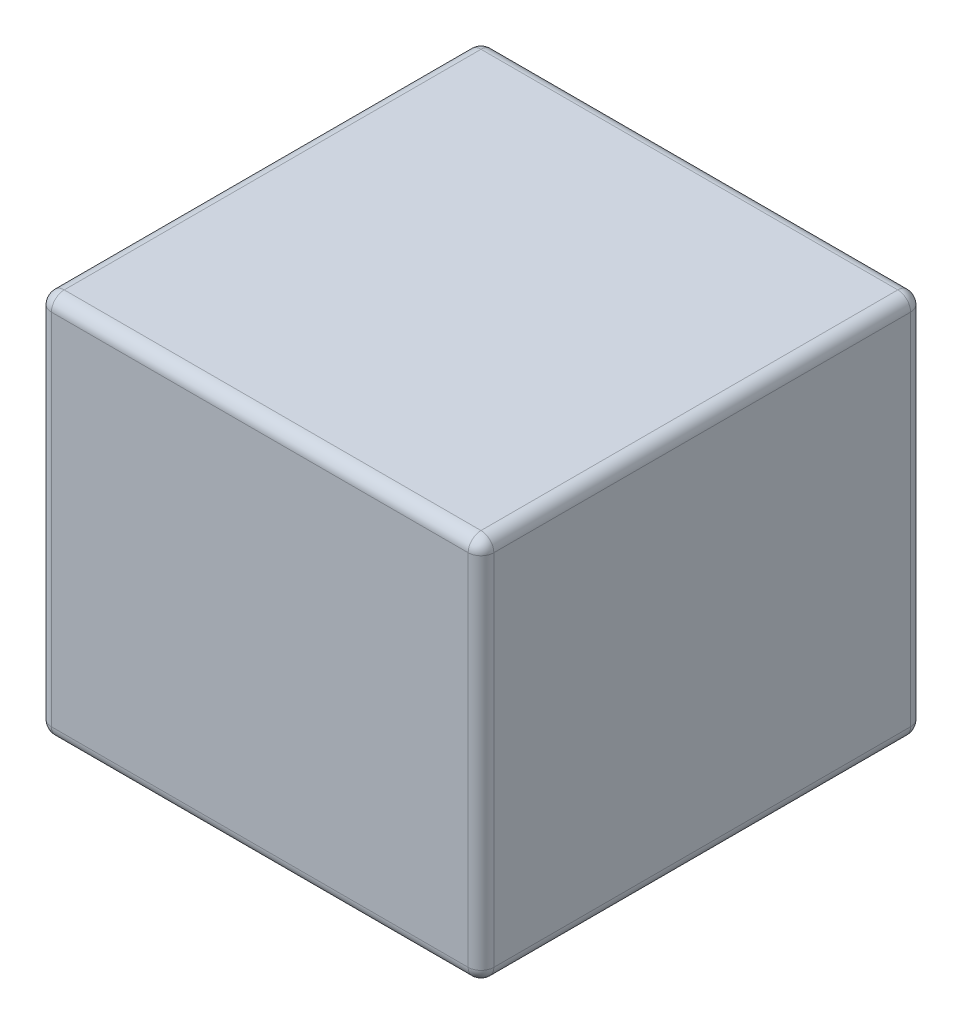
ISO-10303-21;
HEADER;
FILE_DESCRIPTION(('STEP AP214'),'2;1');
FILE_NAME('part.step','',(''),(''),'','','');
FILE_SCHEMA(('AUTOMOTIVE_DESIGN { 1 0 10303 214 1 1 1 1 }'));
ENDSEC;
DATA;
#1=APPLICATION_CONTEXT('core data for automotive mechanical design processes');
#2=APPLICATION_PROTOCOL_DEFINITION('international standard','automotive_design',2000,#1);
#3=PRODUCT_CONTEXT('',#1,'mechanical');
#4=PRODUCT('Part','Part','',(#3));
#5=PRODUCT_RELATED_PRODUCT_CATEGORY('part','',(#4));
#6=PRODUCT_DEFINITION_FORMATION('','',#4);
#7=PRODUCT_DEFINITION_CONTEXT('part definition',#1,'design');
#8=PRODUCT_DEFINITION('design','',#6,#7);
#9=PRODUCT_DEFINITION_SHAPE('','',#8);
#10=(LENGTH_UNIT() NAMED_UNIT(*) SI_UNIT(.MILLI.,.METRE.));
#11=(NAMED_UNIT(*) PLANE_ANGLE_UNIT() SI_UNIT($,.RADIAN.));
#12=(NAMED_UNIT(*) SI_UNIT($,.STERADIAN.) SOLID_ANGLE_UNIT());
#13=UNCERTAINTY_MEASURE_WITH_UNIT(LENGTH_MEASURE(1.E-05),#10,'distance_accuracy_value','');
#14=(GEOMETRIC_REPRESENTATION_CONTEXT(3) GLOBAL_UNCERTAINTY_ASSIGNED_CONTEXT((#13)) GLOBAL_UNIT_ASSIGNED_CONTEXT((#10,
#11,#12)) REPRESENTATION_CONTEXT('',''));
#15=CARTESIAN_POINT('',(0.,0.,0.));
#16=DIRECTION('',(0.,0.,1.));
#17=DIRECTION('',(1.,0.,0.));
#18=AXIS2_PLACEMENT_3D('',#15,#16,#17);
#19=CARTESIAN_POINT('',(21.9075,38.1,21.9075));
#20=DIRECTION('',(-1.,0.,0.));
#21=DIRECTION('',(0.,0.,1.));
#22=AXIS2_PLACEMENT_3D('',#19,#20,#21);
#23=PLANE('',#22);
#24=DIRECTION('',(0.,0.,-1.));
#25=VECTOR('',#24,1.);
#26=CARTESIAN_POINT('',(21.9075,36.83,21.9075));
#27=LINE('',#26,#25);
#28=CARTESIAN_POINT('',(21.9075,36.83,-20.6375));
#29=VERTEX_POINT('',#28);
#30=CARTESIAN_POINT('',(21.9075,36.83,20.6375));
#31=VERTEX_POINT('',#30);
#32=EDGE_CURVE('E41',#29,#31,#27,.F.);
#33=ORIENTED_EDGE('',*,*,#32,.T.);
#34=DIRECTION('',(0.,-1.,0.));
#35=VECTOR('',#34,1.);
#36=CARTESIAN_POINT('',(21.9075,38.1,20.6375));
#37=LINE('',#36,#35);
#38=CARTESIAN_POINT('',(21.9075,1.27,20.6375));
#39=VERTEX_POINT('',#38);
#40=EDGE_CURVE('E11',#31,#39,#37,.T.);
#41=ORIENTED_EDGE('',*,*,#40,.T.);
#42=DIRECTION('',(0.,0.,-1.));
#43=VECTOR('',#42,1.);
#44=CARTESIAN_POINT('',(21.9075,1.27,-21.9075));
#45=LINE('',#44,#43);
#46=CARTESIAN_POINT('',(21.9075,1.27,-20.6375));
#47=VERTEX_POINT('',#46);
#48=EDGE_CURVE('E210',#39,#47,#45,.T.);
#49=ORIENTED_EDGE('',*,*,#48,.T.);
#50=DIRECTION('',(0.,-1.,0.));
#51=VECTOR('',#50,1.);
#52=CARTESIAN_POINT('',(21.9075,38.1,-20.6375));
#53=LINE('',#52,#51);
#54=EDGE_CURVE('E52',#47,#29,#53,.F.);
#55=ORIENTED_EDGE('',*,*,#54,.T.);
#56=EDGE_LOOP('',(#33,#41,#49,#55));
#57=FACE_BOUND('',#56,.T.);
#58=ADVANCED_FACE('F32',(#57),#23,.F.);
#59=CARTESIAN_POINT('',(-21.9075,38.1,-21.9075));
#60=DIRECTION('',(0.,0.,1.));
#61=DIRECTION('',(1.,0.,0.));
#62=AXIS2_PLACEMENT_3D('',#59,#60,#61);
#63=PLANE('',#62);
#64=DIRECTION('',(-1.,0.,0.));
#65=VECTOR('',#64,1.);
#66=CARTESIAN_POINT('',(-21.9075,1.27,-21.9075));
#67=LINE('',#66,#65);
#68=CARTESIAN_POINT('',(20.6375,1.27,-21.9075));
#69=VERTEX_POINT('',#68);
#70=CARTESIAN_POINT('',(-20.6375,1.27,-21.9075));
#71=VERTEX_POINT('',#70);
#72=EDGE_CURVE('E196',#69,#71,#67,.T.);
#73=ORIENTED_EDGE('',*,*,#72,.T.);
#74=DIRECTION('',(0.,-1.,0.));
#75=VECTOR('',#74,1.);
#76=CARTESIAN_POINT('',(-20.6375,38.1,-21.9075));
#77=LINE('',#76,#75);
#78=CARTESIAN_POINT('',(-20.6375,36.83,-21.9075));
#79=VERTEX_POINT('',#78);
#80=EDGE_CURVE('E198',#71,#79,#77,.F.);
#81=ORIENTED_EDGE('',*,*,#80,.T.);
#82=DIRECTION('',(-1.,0.,0.));
#83=VECTOR('',#82,1.);
#84=CARTESIAN_POINT('',(-21.9075,36.83,-21.9075));
#85=LINE('',#84,#83);
#86=CARTESIAN_POINT('',(20.6375,36.83,-21.9075));
#87=VERTEX_POINT('',#86);
#88=EDGE_CURVE('E194',#79,#87,#85,.F.);
#89=ORIENTED_EDGE('',*,*,#88,.T.);
#90=DIRECTION('',(0.,-1.,0.));
#91=VECTOR('',#90,1.);
#92=CARTESIAN_POINT('',(20.6375,38.1,-21.9075));
#93=LINE('',#92,#91);
#94=EDGE_CURVE('E192',#87,#69,#93,.T.);
#95=ORIENTED_EDGE('',*,*,#94,.T.);
#96=EDGE_LOOP('',(#73,#81,#89,#95));
#97=FACE_BOUND('',#96,.T.);
#98=ADVANCED_FACE('F294',(#97),#63,.F.);
#99=CARTESIAN_POINT('',(-21.9075,38.1,21.9075));
#100=DIRECTION('',(1.,0.,0.));
#101=DIRECTION('',(0.,0.,-1.));
#102=AXIS2_PLACEMENT_3D('',#99,#100,#101);
#103=PLANE('',#102);
#104=DIRECTION('',(0.,-1.,0.));
#105=VECTOR('',#104,1.);
#106=CARTESIAN_POINT('',(-21.9075,38.1,-20.6375));
#107=LINE('',#106,#105);
#108=CARTESIAN_POINT('',(-21.9075,36.83,-20.6375));
#109=VERTEX_POINT('',#108);
#110=CARTESIAN_POINT('',(-21.9075,1.27,-20.6375));
#111=VERTEX_POINT('',#110);
#112=EDGE_CURVE('E159',#109,#111,#107,.T.);
#113=ORIENTED_EDGE('',*,*,#112,.T.);
#114=DIRECTION('',(0.,0.,1.));
#115=VECTOR('',#114,1.);
#116=CARTESIAN_POINT('',(-21.9075,1.27,21.9075));
#117=LINE('',#116,#115);
#118=CARTESIAN_POINT('',(-21.9075,1.27,20.6375));
#119=VERTEX_POINT('',#118);
#120=EDGE_CURVE('E180',#111,#119,#117,.T.);
#121=ORIENTED_EDGE('',*,*,#120,.T.);
#122=DIRECTION('',(0.,-1.,0.));
#123=VECTOR('',#122,1.);
#124=CARTESIAN_POINT('',(-21.9075,38.1,20.6375));
#125=LINE('',#124,#123);
#126=CARTESIAN_POINT('',(-21.9075,36.83,20.6375));
#127=VERTEX_POINT('',#126);
#128=EDGE_CURVE('E178',#119,#127,#125,.F.);
#129=ORIENTED_EDGE('',*,*,#128,.T.);
#130=DIRECTION('',(0.,0.,1.));
#131=VECTOR('',#130,1.);
#132=CARTESIAN_POINT('',(-21.9075,36.83,21.9075));
#133=LINE('',#132,#131);
#134=EDGE_CURVE('E156',#127,#109,#133,.F.);
#135=ORIENTED_EDGE('',*,*,#134,.T.);
#136=EDGE_LOOP('',(#113,#121,#129,#135));
#137=FACE_BOUND('',#136,.T.);
#138=ADVANCED_FACE('F360',(#137),#103,.F.);
#139=CARTESIAN_POINT('',(-21.9075,38.1,21.9075));
#140=DIRECTION('',(0.,0.,-1.));
#141=DIRECTION('',(-1.,0.,0.));
#142=AXIS2_PLACEMENT_3D('',#139,#140,#141);
#143=PLANE('',#142);
#144=DIRECTION('',(1.,0.,0.));
#145=VECTOR('',#144,1.);
#146=CARTESIAN_POINT('',(-21.9075,36.83,21.9075));
#147=LINE('',#146,#145);
#148=CARTESIAN_POINT('',(20.6375,36.83,21.9075));
#149=VERTEX_POINT('',#148);
#150=CARTESIAN_POINT('',(-20.6375,36.83,21.9075));
#151=VERTEX_POINT('',#150);
#152=EDGE_CURVE('E185',#149,#151,#147,.F.);
#153=ORIENTED_EDGE('',*,*,#152,.T.);
#154=DIRECTION('',(0.,-1.,0.));
#155=VECTOR('',#154,1.);
#156=CARTESIAN_POINT('',(-20.6375,38.1,21.9075));
#157=LINE('',#156,#155);
#158=CARTESIAN_POINT('',(-20.6375,1.27,21.9075));
#159=VERTEX_POINT('',#158);
#160=EDGE_CURVE('E189',#151,#159,#157,.T.);
#161=ORIENTED_EDGE('',*,*,#160,.T.);
#162=DIRECTION('',(1.,0.,0.));
#163=VECTOR('',#162,1.);
#164=CARTESIAN_POINT('',(21.9075,1.27,21.9075));
#165=LINE('',#164,#163);
#166=CARTESIAN_POINT('',(20.6375,1.27,21.9075));
#167=VERTEX_POINT('',#166);
#168=EDGE_CURVE('E187',#159,#167,#165,.T.);
#169=ORIENTED_EDGE('',*,*,#168,.T.);
#170=DIRECTION('',(0.,-1.,0.));
#171=VECTOR('',#170,1.);
#172=CARTESIAN_POINT('',(20.6375,38.1,21.9075));
#173=LINE('',#172,#171);
#174=EDGE_CURVE('E183',#167,#149,#173,.F.);
#175=ORIENTED_EDGE('',*,*,#174,.T.);
#176=EDGE_LOOP('',(#153,#161,#169,#175));
#177=FACE_BOUND('',#176,.T.);
#178=ADVANCED_FACE('F403',(#177),#143,.F.);
#179=CARTESIAN_POINT('',(0.,38.1,0.));
#180=DIRECTION('',(0.,-1.,0.));
#181=DIRECTION('',(0.,0.,-1.));
#182=AXIS2_PLACEMENT_3D('',#179,#180,#181);
#183=PLANE('',#182);
#184=DIRECTION('',(0.,0.,1.));
#185=VECTOR('',#184,1.);
#186=CARTESIAN_POINT('',(-20.6375,38.1,0.));
#187=LINE('',#186,#185);
#188=CARTESIAN_POINT('',(-20.6375,38.1,-20.6375));
#189=VERTEX_POINT('',#188);
#190=CARTESIAN_POINT('',(-20.6375,38.1,20.6375));
#191=VERTEX_POINT('',#190);
#192=EDGE_CURVE('E205',#189,#191,#187,.T.);
#193=ORIENTED_EDGE('',*,*,#192,.T.);
#194=DIRECTION('',(1.,0.,0.));
#195=VECTOR('',#194,1.);
#196=CARTESIAN_POINT('',(0.,38.1,20.6375));
#197=LINE('',#196,#195);
#198=CARTESIAN_POINT('',(20.6375,38.1,20.6375));
#199=VERTEX_POINT('',#198);
#200=EDGE_CURVE('E207',#191,#199,#197,.T.);
#201=ORIENTED_EDGE('',*,*,#200,.T.);
#202=DIRECTION('',(0.,0.,-1.));
#203=VECTOR('',#202,1.);
#204=CARTESIAN_POINT('',(20.6375,38.1,0.));
#205=LINE('',#204,#203);
#206=CARTESIAN_POINT('',(20.6375,38.1,-20.6375));
#207=VERTEX_POINT('',#206);
#208=EDGE_CURVE('E201',#199,#207,#205,.T.);
#209=ORIENTED_EDGE('',*,*,#208,.T.);
#210=DIRECTION('',(-1.,0.,0.));
#211=VECTOR('',#210,1.);
#212=CARTESIAN_POINT('',(0.,38.1,-20.6375));
#213=LINE('',#212,#211);
#214=EDGE_CURVE('E203',#207,#189,#213,.T.);
#215=ORIENTED_EDGE('',*,*,#214,.T.);
#216=EDGE_LOOP('',(#193,#201,#209,#215));
#217=FACE_BOUND('',#216,.T.);
#218=ADVANCED_FACE('F303',(#217),#183,.F.);
#219=CARTESIAN_POINT('',(20.6375,38.1,21.9075));
#220=DIRECTION('',(-1.,0.,0.));
#221=DIRECTION('',(0.,0.,1.));
#222=AXIS2_PLACEMENT_3D('',#219,#220,#221);
#223=PLANE('',#222);
#224=DIRECTION('',(0.,0.,-1.));
#225=VECTOR('',#224,1.);
#226=CARTESIAN_POINT('',(20.6375,0.,0.));
#227=LINE('',#226,#225);
#228=CARTESIAN_POINT('',(20.6375,0.,20.6375));
#229=VERTEX_POINT('',#228);
#230=CARTESIAN_POINT('',(20.6375,0.,-20.6375));
#231=VERTEX_POINT('',#230);
#232=EDGE_CURVE('E169',#229,#231,#227,.T.);
#233=ORIENTED_EDGE('',*,*,#232,.F.);
#234=DIRECTION('',(0.,-1.,0.));
#235=VECTOR('',#234,1.);
#236=CARTESIAN_POINT('',(20.6375,38.1,20.6375));
#237=LINE('',#236,#235);
#238=CARTESIAN_POINT('',(20.6375,36.83,20.6375));
#239=VERTEX_POINT('',#238);
#240=EDGE_CURVE('E150',#239,#229,#237,.T.);
#241=ORIENTED_EDGE('',*,*,#240,.F.);
#242=DIRECTION('',(0.,0.,-1.));
#243=VECTOR('',#242,1.);
#244=CARTESIAN_POINT('',(20.6375,36.83,0.));
#245=LINE('',#244,#243);
#246=CARTESIAN_POINT('',(20.6375,36.83,-20.6375));
#247=VERTEX_POINT('',#246);
#248=EDGE_CURVE('E136',#239,#247,#245,.T.);
#249=ORIENTED_EDGE('',*,*,#248,.T.);
#250=DIRECTION('',(0.,-1.,0.));
#251=VECTOR('',#250,1.);
#252=CARTESIAN_POINT('',(20.6375,38.1,-20.6375));
#253=LINE('',#252,#251);
#254=EDGE_CURVE('E148',#247,#231,#253,.T.);
#255=ORIENTED_EDGE('',*,*,#254,.T.);
#256=EDGE_LOOP('',(#233,#241,#249,#255));
#257=FACE_BOUND('',#256,.T.);
#258=ADVANCED_FACE('F147',(#257),#223,.T.);
#259=CARTESIAN_POINT('',(-21.9075,38.1,-20.6375));
#260=DIRECTION('',(0.,0.,1.));
#261=DIRECTION('',(1.,0.,0.));
#262=AXIS2_PLACEMENT_3D('',#259,#260,#261);
#263=PLANE('',#262);
#264=DIRECTION('',(-1.,0.,0.));
#265=VECTOR('',#264,1.);
#266=CARTESIAN_POINT('',(0.,0.,-20.6375));
#267=LINE('',#266,#265);
#268=CARTESIAN_POINT('',(-20.6375,0.,-20.6375));
#269=VERTEX_POINT('',#268);
#270=EDGE_CURVE('E155',#231,#269,#267,.T.);
#271=ORIENTED_EDGE('',*,*,#270,.F.);
#272=ORIENTED_EDGE('',*,*,#254,.F.);
#273=DIRECTION('',(-1.,0.,0.));
#274=VECTOR('',#273,1.);
#275=CARTESIAN_POINT('',(0.,36.83,-20.6375));
#276=LINE('',#275,#274);
#277=CARTESIAN_POINT('',(-20.6375,36.83,-20.6375));
#278=VERTEX_POINT('',#277);
#279=EDGE_CURVE('E132',#247,#278,#276,.T.);
#280=ORIENTED_EDGE('',*,*,#279,.T.);
#281=DIRECTION('',(0.,-1.,0.));
#282=VECTOR('',#281,1.);
#283=CARTESIAN_POINT('',(-20.6375,38.1,-20.6375));
#284=LINE('',#283,#282);
#285=EDGE_CURVE('E157',#278,#269,#284,.T.);
#286=ORIENTED_EDGE('',*,*,#285,.T.);
#287=EDGE_LOOP('',(#271,#272,#280,#286));
#288=FACE_BOUND('',#287,.T.);
#289=ADVANCED_FACE('F153',(#288),#263,.T.);
#290=CARTESIAN_POINT('',(-20.6375,38.1,21.9075));
#291=DIRECTION('',(1.,0.,0.));
#292=DIRECTION('',(0.,0.,-1.));
#293=AXIS2_PLACEMENT_3D('',#290,#291,#292);
#294=PLANE('',#293);
#295=DIRECTION('',(0.,0.,1.));
#296=VECTOR('',#295,1.);
#297=CARTESIAN_POINT('',(-20.6375,0.,0.));
#298=LINE('',#297,#296);
#299=CARTESIAN_POINT('',(-20.6375,0.,20.6375));
#300=VERTEX_POINT('',#299);
#301=EDGE_CURVE('E173',#269,#300,#298,.T.);
#302=ORIENTED_EDGE('',*,*,#301,.F.);
#303=ORIENTED_EDGE('',*,*,#285,.F.);
#304=DIRECTION('',(0.,0.,1.));
#305=VECTOR('',#304,1.);
#306=CARTESIAN_POINT('',(-20.6375,36.83,0.));
#307=LINE('',#306,#305);
#308=CARTESIAN_POINT('',(-20.6375,36.83,20.6375));
#309=VERTEX_POINT('',#308);
#310=EDGE_CURVE('E137',#278,#309,#307,.T.);
#311=ORIENTED_EDGE('',*,*,#310,.T.);
#312=DIRECTION('',(0.,-1.,0.));
#313=VECTOR('',#312,1.);
#314=CARTESIAN_POINT('',(-20.6375,38.1,20.6375));
#315=LINE('',#314,#313);
#316=EDGE_CURVE('E161',#309,#300,#315,.T.);
#317=ORIENTED_EDGE('',*,*,#316,.T.);
#318=EDGE_LOOP('',(#302,#303,#311,#317));
#319=FACE_BOUND('',#318,.T.);
#320=ADVANCED_FACE('F397',(#319),#294,.T.);
#321=CARTESIAN_POINT('',(-21.9075,38.1,20.6375));
#322=DIRECTION('',(0.,0.,-1.));
#323=DIRECTION('',(-1.,0.,0.));
#324=AXIS2_PLACEMENT_3D('',#321,#322,#323);
#325=PLANE('',#324);
#326=DIRECTION('',(1.,0.,0.));
#327=VECTOR('',#326,1.);
#328=CARTESIAN_POINT('',(0.,0.,20.6375));
#329=LINE('',#328,#327);
#330=EDGE_CURVE('E151',#300,#229,#329,.T.);
#331=ORIENTED_EDGE('',*,*,#330,.F.);
#332=ORIENTED_EDGE('',*,*,#316,.F.);
#333=DIRECTION('',(1.,0.,0.));
#334=VECTOR('',#333,1.);
#335=CARTESIAN_POINT('',(0.,36.83,20.6375));
#336=LINE('',#335,#334);
#337=EDGE_CURVE('E164',#309,#239,#336,.T.);
#338=ORIENTED_EDGE('',*,*,#337,.T.);
#339=ORIENTED_EDGE('',*,*,#240,.T.);
#340=EDGE_LOOP('',(#331,#332,#338,#339));
#341=FACE_BOUND('',#340,.T.);
#342=ADVANCED_FACE('F395',(#341),#325,.T.);
#343=CARTESIAN_POINT('',(0.,36.83,0.));
#344=DIRECTION('',(0.,-1.,0.));
#345=DIRECTION('',(0.,0.,-1.));
#346=AXIS2_PLACEMENT_3D('',#343,#344,#345);
#347=PLANE('',#346);
#348=ORIENTED_EDGE('',*,*,#248,.F.);
#349=ORIENTED_EDGE('',*,*,#337,.F.);
#350=ORIENTED_EDGE('',*,*,#310,.F.);
#351=ORIENTED_EDGE('',*,*,#279,.F.);
#352=EDGE_LOOP('',(#348,#349,#350,#351));
#353=FACE_BOUND('',#352,.T.);
#354=ADVANCED_FACE('F134',(#353),#347,.T.);
#355=CARTESIAN_POINT('',(20.6375,36.83,0.));
#356=DIRECTION('',(0.,0.,-1.));
#357=DIRECTION('',(-1.,0.,0.));
#358=AXIS2_PLACEMENT_3D('',#355,#356,#357);
#359=CYLINDRICAL_SURFACE('',#358,1.27);
#360=CARTESIAN_POINT('',(20.6375,36.83,-20.6375));
#361=DIRECTION('',(0.,0.,-1.));
#362=DIRECTION('',(-1.,0.,0.));
#363=AXIS2_PLACEMENT_3D('',#360,#361,#362);
#364=CIRCLE('',#363,1.27);
#365=EDGE_CURVE('E36',#207,#29,#364,.T.);
#366=ORIENTED_EDGE('',*,*,#365,.F.);
#367=ORIENTED_EDGE('',*,*,#208,.F.);
#368=CARTESIAN_POINT('',(20.6375,36.83,20.6375));
#369=DIRECTION('',(0.,0.,1.));
#370=DIRECTION('',(1.,0.,0.));
#371=AXIS2_PLACEMENT_3D('',#368,#369,#370);
#372=CIRCLE('',#371,1.27);
#373=EDGE_CURVE('E273',#31,#199,#372,.T.);
#374=ORIENTED_EDGE('',*,*,#373,.F.);
#375=ORIENTED_EDGE('',*,*,#32,.F.);
#376=EDGE_LOOP('',(#366,#367,#374,#375));
#377=FACE_BOUND('',#376,.T.);
#378=ADVANCED_FACE('F34',(#377),#359,.T.);
#379=CARTESIAN_POINT('',(20.6375,36.83,-20.6375));
#380=DIRECTION('',(0.,0.,1.));
#381=DIRECTION('',(1.,0.,0.));
#382=AXIS2_PLACEMENT_3D('',#379,#380,#381);
#383=SPHERICAL_SURFACE('',#382,1.27);
#384=CARTESIAN_POINT('',(20.6375,36.83,-20.6375));
#385=DIRECTION('',(1.,0.,0.));
#386=DIRECTION('',(0.,1.,0.));
#387=AXIS2_PLACEMENT_3D('',#384,#385,#386);
#388=CIRCLE('',#387,1.27);
#389=EDGE_CURVE('E268',#207,#87,#388,.F.);
#390=ORIENTED_EDGE('',*,*,#389,.F.);
#391=ORIENTED_EDGE('',*,*,#365,.T.);
#392=CARTESIAN_POINT('',(20.6375,36.83,-20.6375));
#393=DIRECTION('',(0.,1.,0.));
#394=DIRECTION('',(0.,0.,1.));
#395=AXIS2_PLACEMENT_3D('',#392,#393,#394);
#396=CIRCLE('',#395,1.27);
#397=EDGE_CURVE('E271',#87,#29,#396,.F.);
#398=ORIENTED_EDGE('',*,*,#397,.F.);
#399=EDGE_LOOP('',(#390,#391,#398));
#400=FACE_BOUND('',#399,.T.);
#401=ADVANCED_FACE('F284',(#400),#383,.T.);
#402=CARTESIAN_POINT('',(20.6375,36.83,20.6375));
#403=DIRECTION('',(0.,0.,1.));
#404=DIRECTION('',(1.,0.,0.));
#405=AXIS2_PLACEMENT_3D('',#402,#403,#404);
#406=SPHERICAL_SURFACE('',#405,1.27);
#407=CARTESIAN_POINT('',(20.6375,36.83,20.6375));
#408=DIRECTION('',(0.,1.,0.));
#409=DIRECTION('',(0.,0.,1.));
#410=AXIS2_PLACEMENT_3D('',#407,#408,#409);
#411=CIRCLE('',#410,1.27);
#412=EDGE_CURVE('E263',#31,#149,#411,.F.);
#413=ORIENTED_EDGE('',*,*,#412,.F.);
#414=ORIENTED_EDGE('',*,*,#373,.T.);
#415=CARTESIAN_POINT('',(20.6375,36.83,20.6375));
#416=DIRECTION('',(1.,0.,0.));
#417=DIRECTION('',(0.,0.,-1.));
#418=AXIS2_PLACEMENT_3D('',#415,#416,#417);
#419=CIRCLE('',#418,1.27);
#420=EDGE_CURVE('E266',#149,#199,#419,.F.);
#421=ORIENTED_EDGE('',*,*,#420,.F.);
#422=EDGE_LOOP('',(#413,#414,#421));
#423=FACE_BOUND('',#422,.T.);
#424=ADVANCED_FACE('F319',(#423),#406,.T.);
#425=CARTESIAN_POINT('',(20.6375,38.1,-20.6375));
#426=DIRECTION('',(0.,-1.,0.));
#427=DIRECTION('',(0.,0.,-1.));
#428=AXIS2_PLACEMENT_3D('',#425,#426,#427);
#429=CYLINDRICAL_SURFACE('',#428,1.27);
#430=ORIENTED_EDGE('',*,*,#397,.T.);
#431=ORIENTED_EDGE('',*,*,#54,.F.);
#432=CARTESIAN_POINT('',(20.6375,1.27,-20.6375));
#433=DIRECTION('',(0.,-1.,0.));
#434=DIRECTION('',(0.,0.,-1.));
#435=AXIS2_PLACEMENT_3D('',#432,#433,#434);
#436=CIRCLE('',#435,1.27);
#437=EDGE_CURVE('E257',#69,#47,#436,.T.);
#438=ORIENTED_EDGE('',*,*,#437,.F.);
#439=ORIENTED_EDGE('',*,*,#94,.F.);
#440=EDGE_LOOP('',(#430,#431,#438,#439));
#441=FACE_BOUND('',#440,.T.);
#442=ADVANCED_FACE('F289',(#441),#429,.T.);
#443=CARTESIAN_POINT('',(0.,36.83,-20.6375));
#444=DIRECTION('',(-1.,0.,0.));
#445=DIRECTION('',(0.,0.,1.));
#446=AXIS2_PLACEMENT_3D('',#443,#444,#445);
#447=CYLINDRICAL_SURFACE('',#446,1.27);
#448=ORIENTED_EDGE('',*,*,#389,.T.);
#449=ORIENTED_EDGE('',*,*,#88,.F.);
#450=CARTESIAN_POINT('',(-20.6375,36.83,-20.6375));
#451=DIRECTION('',(-1.,0.,0.));
#452=DIRECTION('',(0.,0.,1.));
#453=AXIS2_PLACEMENT_3D('',#450,#451,#452);
#454=CIRCLE('',#453,1.27);
#455=EDGE_CURVE('E254',#189,#79,#454,.T.);
#456=ORIENTED_EDGE('',*,*,#455,.F.);
#457=ORIENTED_EDGE('',*,*,#214,.F.);
#458=EDGE_LOOP('',(#448,#449,#456,#457));
#459=FACE_BOUND('',#458,.T.);
#460=ADVANCED_FACE('F300',(#459),#447,.T.);
#461=CARTESIAN_POINT('',(-20.6375,36.83,0.));
#462=DIRECTION('',(0.,0.,1.));
#463=DIRECTION('',(1.,0.,0.));
#464=AXIS2_PLACEMENT_3D('',#461,#462,#463);
#465=CYLINDRICAL_SURFACE('',#464,1.27);
#466=CARTESIAN_POINT('',(-20.6375,36.83,20.6375));
#467=DIRECTION('',(0.,0.,1.));
#468=DIRECTION('',(1.,0.,0.));
#469=AXIS2_PLACEMENT_3D('',#466,#467,#468);
#470=CIRCLE('',#469,1.27);
#471=EDGE_CURVE('E248',#191,#127,#470,.T.);
#472=ORIENTED_EDGE('',*,*,#471,.F.);
#473=ORIENTED_EDGE('',*,*,#192,.F.);
#474=CARTESIAN_POINT('',(-20.6375,36.83,-20.6375));
#475=DIRECTION('',(0.,0.,-1.));
#476=DIRECTION('',(0.,1.,0.));
#477=AXIS2_PLACEMENT_3D('',#474,#475,#476);
#478=CIRCLE('',#477,1.27);
#479=EDGE_CURVE('E251',#109,#189,#478,.T.);
#480=ORIENTED_EDGE('',*,*,#479,.F.);
#481=ORIENTED_EDGE('',*,*,#134,.F.);
#482=EDGE_LOOP('',(#472,#473,#480,#481));
#483=FACE_BOUND('',#482,.T.);
#484=ADVANCED_FACE('F308',(#483),#465,.T.);
#485=CARTESIAN_POINT('',(0.,36.83,20.6375));
#486=DIRECTION('',(1.,0.,0.));
#487=DIRECTION('',(0.,0.,-1.));
#488=AXIS2_PLACEMENT_3D('',#485,#486,#487);
#489=CYLINDRICAL_SURFACE('',#488,1.27);
#490=ORIENTED_EDGE('',*,*,#420,.T.);
#491=ORIENTED_EDGE('',*,*,#200,.F.);
#492=CARTESIAN_POINT('',(-20.6375,36.83,20.6375));
#493=DIRECTION('',(-1.,0.,0.));
#494=DIRECTION('',(0.,0.,1.));
#495=AXIS2_PLACEMENT_3D('',#492,#493,#494);
#496=CIRCLE('',#495,1.27);
#497=EDGE_CURVE('E245',#151,#191,#496,.T.);
#498=ORIENTED_EDGE('',*,*,#497,.F.);
#499=ORIENTED_EDGE('',*,*,#152,.F.);
#500=EDGE_LOOP('',(#490,#491,#498,#499));
#501=FACE_BOUND('',#500,.T.);
#502=ADVANCED_FACE('F318',(#501),#489,.T.);
#503=CARTESIAN_POINT('',(20.6375,38.1,20.6375));
#504=DIRECTION('',(0.,-1.,0.));
#505=DIRECTION('',(0.,0.,-1.));
#506=AXIS2_PLACEMENT_3D('',#503,#504,#505);
#507=CYLINDRICAL_SURFACE('',#506,1.27);
#508=ORIENTED_EDGE('',*,*,#412,.T.);
#509=ORIENTED_EDGE('',*,*,#174,.F.);
#510=CARTESIAN_POINT('',(20.6375,1.27,20.6375));
#511=DIRECTION('',(0.,-1.,0.));
#512=DIRECTION('',(0.,0.,-1.));
#513=AXIS2_PLACEMENT_3D('',#510,#511,#512);
#514=CIRCLE('',#513,1.27);
#515=EDGE_CURVE('E242',#39,#167,#514,.T.);
#516=ORIENTED_EDGE('',*,*,#515,.F.);
#517=ORIENTED_EDGE('',*,*,#40,.F.);
#518=EDGE_LOOP('',(#508,#509,#516,#517));
#519=FACE_BOUND('',#518,.T.);
#520=ADVANCED_FACE('F324',(#519),#507,.T.);
#521=CARTESIAN_POINT('',(20.6375,1.27,21.9075));
#522=DIRECTION('',(0.,0.,1.));
#523=DIRECTION('',(1.,0.,0.));
#524=AXIS2_PLACEMENT_3D('',#521,#522,#523);
#525=CYLINDRICAL_SURFACE('',#524,1.27);
#526=CARTESIAN_POINT('',(20.6375,1.27,-20.6375));
#527=DIRECTION('',(0.,0.,-1.));
#528=DIRECTION('',(-1.,0.,0.));
#529=AXIS2_PLACEMENT_3D('',#526,#527,#528);
#530=CIRCLE('',#529,1.27);
#531=EDGE_CURVE('E260',#47,#231,#530,.T.);
#532=ORIENTED_EDGE('',*,*,#531,.F.);
#533=ORIENTED_EDGE('',*,*,#48,.F.);
#534=CARTESIAN_POINT('',(20.6375,1.27,20.6375));
#535=DIRECTION('',(0.,0.,1.));
#536=DIRECTION('',(1.,0.,0.));
#537=AXIS2_PLACEMENT_3D('',#534,#535,#536);
#538=CIRCLE('',#537,1.27);
#539=EDGE_CURVE('E240',#229,#39,#538,.T.);
#540=ORIENTED_EDGE('',*,*,#539,.F.);
#541=ORIENTED_EDGE('',*,*,#232,.T.);
#542=EDGE_LOOP('',(#532,#533,#540,#541));
#543=FACE_BOUND('',#542,.T.);
#544=ADVANCED_FACE('F328',(#543),#525,.T.);
#545=CARTESIAN_POINT('',(20.6375,1.27,-20.6375));
#546=DIRECTION('',(0.,0.,1.));
#547=DIRECTION('',(1.,0.,0.));
#548=AXIS2_PLACEMENT_3D('',#545,#546,#547);
#549=SPHERICAL_SURFACE('',#548,1.27);
#550=ORIENTED_EDGE('',*,*,#437,.T.);
#551=ORIENTED_EDGE('',*,*,#531,.T.);
#552=CARTESIAN_POINT('',(20.6375,1.27,-20.6375));
#553=DIRECTION('',(1.,0.,0.));
#554=DIRECTION('',(0.,0.,-1.));
#555=AXIS2_PLACEMENT_3D('',#552,#553,#554);
#556=CIRCLE('',#555,1.27);
#557=EDGE_CURVE('E237',#69,#231,#556,.F.);
#558=ORIENTED_EDGE('',*,*,#557,.F.);
#559=EDGE_LOOP('',(#550,#551,#558));
#560=FACE_BOUND('',#559,.T.);
#561=ADVANCED_FACE('F331',(#560),#549,.T.);
#562=CARTESIAN_POINT('',(-20.6375,36.83,-20.6375));
#563=DIRECTION('',(0.,0.,1.));
#564=DIRECTION('',(1.,0.,0.));
#565=AXIS2_PLACEMENT_3D('',#562,#563,#564);
#566=SPHERICAL_SURFACE('',#565,1.27);
#567=ORIENTED_EDGE('',*,*,#479,.T.);
#568=ORIENTED_EDGE('',*,*,#455,.T.);
#569=CARTESIAN_POINT('',(-20.6375,36.83,-20.6375));
#570=DIRECTION('',(0.,1.,0.));
#571=DIRECTION('',(0.,0.,1.));
#572=AXIS2_PLACEMENT_3D('',#569,#570,#571);
#573=CIRCLE('',#572,1.27);
#574=EDGE_CURVE('E235',#109,#79,#573,.F.);
#575=ORIENTED_EDGE('',*,*,#574,.F.);
#576=EDGE_LOOP('',(#567,#568,#575));
#577=FACE_BOUND('',#576,.T.);
#578=ADVANCED_FACE('F345',(#577),#566,.T.);
#579=CARTESIAN_POINT('',(-20.6375,36.83,20.6375));
#580=DIRECTION('',(0.,0.,1.));
#581=DIRECTION('',(1.,0.,0.));
#582=AXIS2_PLACEMENT_3D('',#579,#580,#581);
#583=SPHERICAL_SURFACE('',#582,1.27);
#584=ORIENTED_EDGE('',*,*,#497,.T.);
#585=ORIENTED_EDGE('',*,*,#471,.T.);
#586=CARTESIAN_POINT('',(-20.6375,36.83,20.6375));
#587=DIRECTION('',(0.,1.,0.));
#588=DIRECTION('',(0.,0.,1.));
#589=AXIS2_PLACEMENT_3D('',#586,#587,#588);
#590=CIRCLE('',#589,1.27);
#591=EDGE_CURVE('E232',#151,#127,#590,.F.);
#592=ORIENTED_EDGE('',*,*,#591,.F.);
#593=EDGE_LOOP('',(#584,#585,#592));
#594=FACE_BOUND('',#593,.T.);
#595=ADVANCED_FACE('F314',(#594),#583,.T.);
#596=CARTESIAN_POINT('',(20.6375,1.27,20.6375));
#597=DIRECTION('',(0.,0.,1.));
#598=DIRECTION('',(1.,0.,0.));
#599=AXIS2_PLACEMENT_3D('',#596,#597,#598);
#600=SPHERICAL_SURFACE('',#599,1.27);
#601=ORIENTED_EDGE('',*,*,#539,.T.);
#602=ORIENTED_EDGE('',*,*,#515,.T.);
#603=CARTESIAN_POINT('',(20.6375,1.27,20.6375));
#604=DIRECTION('',(1.,0.,0.));
#605=DIRECTION('',(0.,0.,-1.));
#606=AXIS2_PLACEMENT_3D('',#603,#604,#605);
#607=CIRCLE('',#606,1.27);
#608=EDGE_CURVE('E229',#229,#167,#607,.F.);
#609=ORIENTED_EDGE('',*,*,#608,.F.);
#610=EDGE_LOOP('',(#601,#602,#609));
#611=FACE_BOUND('',#610,.T.);
#612=ADVANCED_FACE('F352',(#611),#600,.T.);
#613=CARTESIAN_POINT('',(-21.9075,1.27,-20.6375));
#614=DIRECTION('',(1.,0.,0.));
#615=DIRECTION('',(0.,0.,-1.));
#616=AXIS2_PLACEMENT_3D('',#613,#614,#615);
#617=CYLINDRICAL_SURFACE('',#616,1.27);
#618=ORIENTED_EDGE('',*,*,#557,.T.);
#619=ORIENTED_EDGE('',*,*,#270,.T.);
#620=CARTESIAN_POINT('',(-20.6375,1.27,-20.6375));
#621=DIRECTION('',(-1.,0.,0.));
#622=DIRECTION('',(0.,0.,1.));
#623=AXIS2_PLACEMENT_3D('',#620,#621,#622);
#624=CIRCLE('',#623,1.27);
#625=EDGE_CURVE('E226',#71,#269,#624,.T.);
#626=ORIENTED_EDGE('',*,*,#625,.F.);
#627=ORIENTED_EDGE('',*,*,#72,.F.);
#628=EDGE_LOOP('',(#618,#619,#626,#627));
#629=FACE_BOUND('',#628,.T.);
#630=ADVANCED_FACE('F334',(#629),#617,.T.);
#631=CARTESIAN_POINT('',(-20.6375,38.1,-20.6375));
#632=DIRECTION('',(0.,-1.,0.));
#633=DIRECTION('',(0.,0.,-1.));
#634=AXIS2_PLACEMENT_3D('',#631,#632,#633);
#635=CYLINDRICAL_SURFACE('',#634,1.27);
#636=ORIENTED_EDGE('',*,*,#574,.T.);
#637=ORIENTED_EDGE('',*,*,#80,.F.);
#638=CARTESIAN_POINT('',(-20.6375,1.27,-20.6375));
#639=DIRECTION('',(0.,-1.,0.));
#640=DIRECTION('',(0.,0.,-1.));
#641=AXIS2_PLACEMENT_3D('',#638,#639,#640);
#642=CIRCLE('',#641,1.27);
#643=EDGE_CURVE('E223',#111,#71,#642,.T.);
#644=ORIENTED_EDGE('',*,*,#643,.F.);
#645=ORIENTED_EDGE('',*,*,#112,.F.);
#646=EDGE_LOOP('',(#636,#637,#644,#645));
#647=FACE_BOUND('',#646,.T.);
#648=ADVANCED_FACE('F343',(#647),#635,.T.);
#649=CARTESIAN_POINT('',(-20.6375,38.1,20.6375));
#650=DIRECTION('',(0.,-1.,0.));
#651=DIRECTION('',(0.,0.,-1.));
#652=AXIS2_PLACEMENT_3D('',#649,#650,#651);
#653=CYLINDRICAL_SURFACE('',#652,1.27);
#654=ORIENTED_EDGE('',*,*,#591,.T.);
#655=ORIENTED_EDGE('',*,*,#128,.F.);
#656=CARTESIAN_POINT('',(-20.6375,1.27,20.6375));
#657=DIRECTION('',(0.,-1.,0.));
#658=DIRECTION('',(0.,0.,-1.));
#659=AXIS2_PLACEMENT_3D('',#656,#657,#658);
#660=CIRCLE('',#659,1.27);
#661=EDGE_CURVE('E220',#159,#119,#660,.T.);
#662=ORIENTED_EDGE('',*,*,#661,.F.);
#663=ORIENTED_EDGE('',*,*,#160,.F.);
#664=EDGE_LOOP('',(#654,#655,#662,#663));
#665=FACE_BOUND('',#664,.T.);
#666=ADVANCED_FACE('F377',(#665),#653,.T.);
#667=CARTESIAN_POINT('',(-21.9075,1.27,20.6375));
#668=DIRECTION('',(-1.,0.,0.));
#669=DIRECTION('',(0.,0.,1.));
#670=AXIS2_PLACEMENT_3D('',#667,#668,#669);
#671=CYLINDRICAL_SURFACE('',#670,1.27);
#672=ORIENTED_EDGE('',*,*,#608,.T.);
#673=ORIENTED_EDGE('',*,*,#168,.F.);
#674=CARTESIAN_POINT('',(-20.6375,1.27,20.6375));
#675=DIRECTION('',(-1.,0.,0.));
#676=DIRECTION('',(0.,0.,1.));
#677=AXIS2_PLACEMENT_3D('',#674,#675,#676);
#678=CIRCLE('',#677,1.27);
#679=EDGE_CURVE('E218',#300,#159,#678,.T.);
#680=ORIENTED_EDGE('',*,*,#679,.F.);
#681=ORIENTED_EDGE('',*,*,#330,.T.);
#682=EDGE_LOOP('',(#672,#673,#680,#681));
#683=FACE_BOUND('',#682,.T.);
#684=ADVANCED_FACE('F374',(#683),#671,.T.);
#685=CARTESIAN_POINT('',(-20.6375,1.27,-20.6375));
#686=DIRECTION('',(0.,0.,1.));
#687=DIRECTION('',(1.,0.,0.));
#688=AXIS2_PLACEMENT_3D('',#685,#686,#687);
#689=SPHERICAL_SURFACE('',#688,1.27);
#690=ORIENTED_EDGE('',*,*,#643,.T.);
#691=ORIENTED_EDGE('',*,*,#625,.T.);
#692=CARTESIAN_POINT('',(-20.6375,1.27,-20.6375));
#693=DIRECTION('',(0.,0.,-1.));
#694=DIRECTION('',(-1.,0.,0.));
#695=AXIS2_PLACEMENT_3D('',#692,#693,#694);
#696=CIRCLE('',#695,1.27);
#697=EDGE_CURVE('E216',#111,#269,#696,.F.);
#698=ORIENTED_EDGE('',*,*,#697,.F.);
#699=EDGE_LOOP('',(#690,#691,#698));
#700=FACE_BOUND('',#699,.T.);
#701=ADVANCED_FACE('F339',(#700),#689,.T.);
#702=CARTESIAN_POINT('',(-20.6375,1.27,20.6375));
#703=DIRECTION('',(0.,0.,1.));
#704=DIRECTION('',(1.,0.,0.));
#705=AXIS2_PLACEMENT_3D('',#702,#703,#704);
#706=SPHERICAL_SURFACE('',#705,1.27);
#707=ORIENTED_EDGE('',*,*,#679,.T.);
#708=ORIENTED_EDGE('',*,*,#661,.T.);
#709=CARTESIAN_POINT('',(-20.6375,1.27,20.6375));
#710=DIRECTION('',(0.,0.,1.));
#711=DIRECTION('',(1.,0.,0.));
#712=AXIS2_PLACEMENT_3D('',#709,#710,#711);
#713=CIRCLE('',#712,1.27);
#714=EDGE_CURVE('E214',#300,#119,#713,.F.);
#715=ORIENTED_EDGE('',*,*,#714,.F.);
#716=EDGE_LOOP('',(#707,#708,#715));
#717=FACE_BOUND('',#716,.T.);
#718=ADVANCED_FACE('F367',(#717),#706,.T.);
#719=CARTESIAN_POINT('',(-20.6375,1.27,21.9075));
#720=DIRECTION('',(0.,0.,-1.));
#721=DIRECTION('',(-1.,0.,0.));
#722=AXIS2_PLACEMENT_3D('',#719,#720,#721);
#723=CYLINDRICAL_SURFACE('',#722,1.27);
#724=ORIENTED_EDGE('',*,*,#697,.T.);
#725=ORIENTED_EDGE('',*,*,#301,.T.);
#726=ORIENTED_EDGE('',*,*,#714,.T.);
#727=ORIENTED_EDGE('',*,*,#120,.F.);
#728=EDGE_LOOP('',(#724,#725,#726,#727));
#729=FACE_BOUND('',#728,.T.);
#730=ADVANCED_FACE('F364',(#729),#723,.T.);
#731=CLOSED_SHELL('',(#58,#98,#138,#178,#218,#258,#289,#320,#342,#354,#378,#401,#424,#442,#460,
#484,#502,#520,#544,#561,#578,#595,#612,#630,#648,#666,#684,#701,#718,#730));
#732=MANIFOLD_SOLID_BREP('B2',#731);
#733=ADVANCED_BREP_SHAPE_REPRESENTATION('',(#18,#732),#14);
#734=SHAPE_DEFINITION_REPRESENTATION(#9,#733);
ENDSEC;
END-ISO-10303-21;
